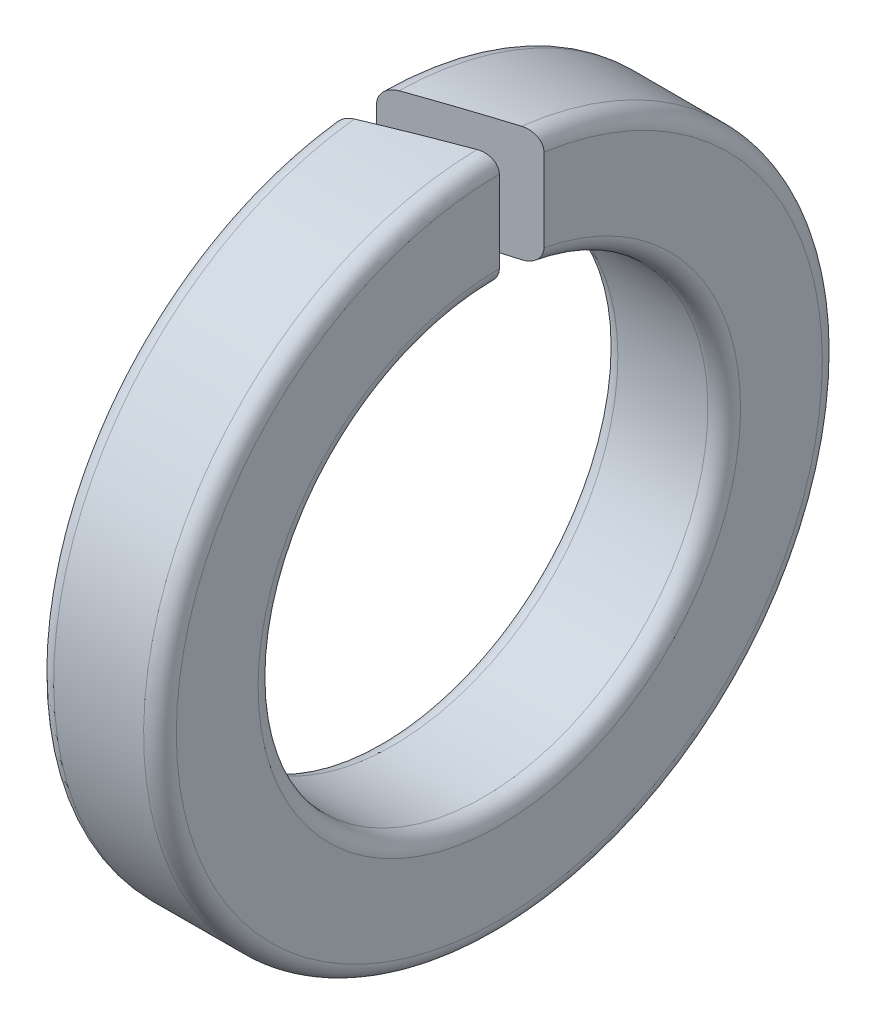
ISO-10303-21;
HEADER;
FILE_DESCRIPTION(('STEP AP214'),'2;1');
FILE_NAME('part.step','',(''),(''),'','','');
FILE_SCHEMA(('AUTOMOTIVE_DESIGN { 1 0 10303 214 1 1 1 1 }'));
ENDSEC;
DATA;
#1=APPLICATION_CONTEXT('core data for automotive mechanical design processes');
#2=APPLICATION_PROTOCOL_DEFINITION('international standard','automotive_design',2000,#1);
#3=PRODUCT_CONTEXT('',#1,'mechanical');
#4=PRODUCT('Part','Part','',(#3));
#5=PRODUCT_RELATED_PRODUCT_CATEGORY('part','',(#4));
#6=PRODUCT_DEFINITION_FORMATION('','',#4);
#7=PRODUCT_DEFINITION_CONTEXT('part definition',#1,'design');
#8=PRODUCT_DEFINITION('design','',#6,#7);
#9=PRODUCT_DEFINITION_SHAPE('','',#8);
#10=(LENGTH_UNIT() NAMED_UNIT(*) SI_UNIT(.MILLI.,.METRE.));
#11=(NAMED_UNIT(*) PLANE_ANGLE_UNIT() SI_UNIT($,.RADIAN.));
#12=(NAMED_UNIT(*) SI_UNIT($,.STERADIAN.) SOLID_ANGLE_UNIT());
#13=UNCERTAINTY_MEASURE_WITH_UNIT(LENGTH_MEASURE(1.E-05),#10,'distance_accuracy_value','');
#14=(GEOMETRIC_REPRESENTATION_CONTEXT(3) GLOBAL_UNCERTAINTY_ASSIGNED_CONTEXT((#13)) GLOBAL_UNIT_ASSIGNED_CONTEXT((#10,
#11,#12)) REPRESENTATION_CONTEXT('',''));
#15=CARTESIAN_POINT('',(0.,0.,0.));
#16=DIRECTION('',(0.,0.,1.));
#17=DIRECTION('',(1.,0.,0.));
#18=AXIS2_PLACEMENT_3D('',#15,#16,#17);
#19=CARTESIAN_POINT('',(0.,0.,-4.15));
#20=DIRECTION('',(1.,0.,0.));
#21=DIRECTION('',(0.,0.,-1.));
#22=AXIS2_PLACEMENT_3D('',#19,#20,#21);
#23=PLANE('',#22);
#24=DIRECTION('',(0.,-1.,0.));
#25=VECTOR('',#24,1.);
#26=CARTESIAN_POINT('',(0.,4.15,0.));
#27=LINE('',#26,#25);
#28=CARTESIAN_POINT('',(0.,3.95,0.));
#29=VERTEX_POINT('',#28);
#30=CARTESIAN_POINT('',(0.,2.95,0.));
#31=VERTEX_POINT('',#30);
#32=EDGE_CURVE('E215',#29,#31,#27,.T.);
#33=ORIENTED_EDGE('',*,*,#32,.F.);
#34=CARTESIAN_POINT('',(0.,0.,0.));
#35=DIRECTION('',(1.,0.,0.));
#36=DIRECTION('',(0.,0.,-1.));
#37=AXIS2_PLACEMENT_3D('',#34,#35,#36);
#38=CIRCLE('',#37,3.95);
#39=CARTESIAN_POINT('',(0.,3.91208802997561,0.545955351399305));
#40=VERTEX_POINT('',#39);
#41=EDGE_CURVE('E217',#29,#40,#38,.F.);
#42=ORIENTED_EDGE('',*,*,#41,.T.);
#43=DIRECTION('',(0.,-1.,0.));
#44=VECTOR('',#43,1.);
#45=CARTESIAN_POINT('',(0.,4.15,0.545955351399305));
#46=LINE('',#45,#44);
#47=CARTESIAN_POINT('',(0.,2.89903997114191,0.545955351399305));
#48=VERTEX_POINT('',#47);
#49=EDGE_CURVE('E105',#40,#48,#46,.T.);
#50=ORIENTED_EDGE('',*,*,#49,.T.);
#51=CARTESIAN_POINT('',(0.,0.,0.));
#52=DIRECTION('',(1.,0.,0.));
#53=DIRECTION('',(0.,0.,-1.));
#54=AXIS2_PLACEMENT_3D('',#51,#52,#53);
#55=CIRCLE('',#54,2.95);
#56=EDGE_CURVE('E50',#48,#31,#55,.T.);
#57=ORIENTED_EDGE('',*,*,#56,.T.);
#58=EDGE_LOOP('',(#33,#42,#50,#57));
#59=FACE_BOUND('',#58,.T.);
#60=ADVANCED_FACE('F36',(#59),#23,.F.);
#61=CARTESIAN_POINT('',(0.,0.,0.));
#62=DIRECTION('',(-1.,0.,0.));
#63=DIRECTION('',(0.,0.,1.));
#64=AXIS2_PLACEMENT_3D('',#61,#62,#63);
#65=CYLINDRICAL_SURFACE('',#64,2.75);
#66=CARTESIAN_POINT('',(1.5,0.,0.));
#67=DIRECTION('',(-0.342020143325669,0.,-0.939692620785908));
#68=DIRECTION('',(-0.939692620785908,0.,0.342020143325669));
#69=AXIS2_PLACEMENT_3D('',#66,#67,#68);
#70=ELLIPSE('',#69,8.04046210044847,2.75);
#71=CARTESIAN_POINT('',(1.3,2.74903638148765,0.072794046853241));
#72=VERTEX_POINT('',#71);
#73=CARTESIAN_POINT('',(0.2,2.70898844218285,0.473161304546064));
#74=VERTEX_POINT('',#73);
#75=EDGE_CURVE('E226',#72,#74,#70,.F.);
#76=ORIENTED_EDGE('',*,*,#75,.F.);
#77=CARTESIAN_POINT('',(1.3,0.,0.));
#78=DIRECTION('',(-1.,0.,0.));
#79=DIRECTION('',(0.,0.,1.));
#80=AXIS2_PLACEMENT_3D('',#77,#78,#79);
#81=CIRCLE('',#80,2.75);
#82=CARTESIAN_POINT('',(1.3,2.70898844218285,-0.473161304546064));
#83=VERTEX_POINT('',#82);
#84=EDGE_CURVE('E11',#72,#83,#81,.F.);
#85=ORIENTED_EDGE('',*,*,#84,.T.);
#86=CARTESIAN_POINT('',(0.,0.,0.));
#87=DIRECTION('',(0.34202014332567,0.,0.939692620785908));
#88=DIRECTION('',(-0.939692620785908,0.,0.342020143325669));
#89=AXIS2_PLACEMENT_3D('',#86,#87,#88);
#90=ELLIPSE('',#89,8.04046210044847,2.75);
#91=CARTESIAN_POINT('',(0.2,2.74903638148765,-0.0727940468532407));
#92=VERTEX_POINT('',#91);
#93=EDGE_CURVE('E228',#92,#83,#90,.F.);
#94=ORIENTED_EDGE('',*,*,#93,.F.);
#95=CARTESIAN_POINT('',(0.2,0.,0.));
#96=DIRECTION('',(1.,0.,0.));
#97=DIRECTION('',(0.,0.,-1.));
#98=AXIS2_PLACEMENT_3D('',#95,#96,#97);
#99=CIRCLE('',#98,2.75);
#100=EDGE_CURVE('E43',#92,#74,#99,.F.);
#101=ORIENTED_EDGE('',*,*,#100,.T.);
#102=EDGE_LOOP('',(#76,#85,#94,#101));
#103=FACE_BOUND('',#102,.T.);
#104=ADVANCED_FACE('F225',(#103),#65,.F.);
#105=CARTESIAN_POINT('',(1.5,0.,-4.15));
#106=DIRECTION('',(-1.,0.,0.));
#107=DIRECTION('',(0.,0.,1.));
#108=AXIS2_PLACEMENT_3D('',#105,#106,#107);
#109=PLANE('',#108);
#110=DIRECTION('',(0.,-1.,0.));
#111=VECTOR('',#110,1.);
#112=CARTESIAN_POINT('',(1.5,4.15,0.));
#113=LINE('',#112,#111);
#114=CARTESIAN_POINT('',(1.5,3.95,0.));
#115=VERTEX_POINT('',#114);
#116=CARTESIAN_POINT('',(1.5,2.95,0.));
#117=VERTEX_POINT('',#116);
#118=EDGE_CURVE('E210',#115,#117,#113,.T.);
#119=ORIENTED_EDGE('',*,*,#118,.F.);
#120=CARTESIAN_POINT('',(1.5,0.,0.));
#121=DIRECTION('',(-1.,0.,0.));
#122=DIRECTION('',(0.,0.,1.));
#123=AXIS2_PLACEMENT_3D('',#120,#121,#122);
#124=CIRCLE('',#123,3.95);
#125=CARTESIAN_POINT('',(1.5,3.91208802997561,-0.545955351399305));
#126=VERTEX_POINT('',#125);
#127=EDGE_CURVE('E160',#115,#126,#124,.F.);
#128=ORIENTED_EDGE('',*,*,#127,.T.);
#129=DIRECTION('',(0.,-1.,0.));
#130=VECTOR('',#129,1.);
#131=CARTESIAN_POINT('',(1.5,4.15,-0.545955351399305));
#132=LINE('',#131,#130);
#133=CARTESIAN_POINT('',(1.5,2.89903997114191,-0.545955351399305));
#134=VERTEX_POINT('',#133);
#135=EDGE_CURVE('E209',#126,#134,#132,.T.);
#136=ORIENTED_EDGE('',*,*,#135,.T.);
#137=CARTESIAN_POINT('',(1.5,0.,0.));
#138=DIRECTION('',(-1.,0.,0.));
#139=DIRECTION('',(0.,0.,1.));
#140=AXIS2_PLACEMENT_3D('',#137,#138,#139);
#141=CIRCLE('',#140,2.95);
#142=EDGE_CURVE('E199',#134,#117,#141,.T.);
#143=ORIENTED_EDGE('',*,*,#142,.T.);
#144=EDGE_LOOP('',(#119,#128,#136,#143));
#145=FACE_BOUND('',#144,.T.);
#146=ADVANCED_FACE('F208',(#145),#109,.F.);
#147=CARTESIAN_POINT('',(0.,0.,0.));
#148=DIRECTION('',(-1.,0.,0.));
#149=DIRECTION('',(0.,0.,1.));
#150=AXIS2_PLACEMENT_3D('',#147,#148,#149);
#151=CYLINDRICAL_SURFACE('',#150,4.15);
#152=CARTESIAN_POINT('',(0.,0.,0.));
#153=DIRECTION('',(0.34202014332567,0.,0.939692620785908));
#154=DIRECTION('',(-0.939692620785908,0.,0.342020143325669));
#155=AXIS2_PLACEMENT_3D('',#152,#153,#154);
#156=ELLIPSE('',#155,12.1337882606768,4.15);
#157=CARTESIAN_POINT('',(1.30000000000001,4.12293807616368,-0.473161304546067));
#158=VERTEX_POINT('',#157);
#159=CARTESIAN_POINT('',(0.200000000000004,4.14936152037187,-0.0727940468532419));
#160=VERTEX_POINT('',#159);
#161=EDGE_CURVE('E120',#158,#160,#156,.T.);
#162=ORIENTED_EDGE('',*,*,#161,.F.);
#163=CARTESIAN_POINT('',(1.3,0.,0.));
#164=DIRECTION('',(-1.,0.,0.));
#165=DIRECTION('',(0.,0.,1.));
#166=AXIS2_PLACEMENT_3D('',#163,#164,#165);
#167=CIRCLE('',#166,4.15);
#168=CARTESIAN_POINT('',(1.3,4.14936152037187,0.0727940468532405));
#169=VERTEX_POINT('',#168);
#170=EDGE_CURVE('E119',#158,#169,#167,.T.);
#171=ORIENTED_EDGE('',*,*,#170,.T.);
#172=CARTESIAN_POINT('',(1.5,0.,0.));
#173=DIRECTION('',(-0.342020143325669,0.,-0.939692620785908));
#174=DIRECTION('',(-0.939692620785908,0.,0.342020143325669));
#175=AXIS2_PLACEMENT_3D('',#172,#173,#174);
#176=ELLIPSE('',#175,12.1337882606768,4.15);
#177=CARTESIAN_POINT('',(0.2,4.12293807616368,0.473161304546064));
#178=VERTEX_POINT('',#177);
#179=EDGE_CURVE('E104',#178,#169,#176,.T.);
#180=ORIENTED_EDGE('',*,*,#179,.F.);
#181=CARTESIAN_POINT('',(0.2,0.,0.));
#182=DIRECTION('',(1.,0.,0.));
#183=DIRECTION('',(0.,0.,-1.));
#184=AXIS2_PLACEMENT_3D('',#181,#182,#183);
#185=CIRCLE('',#184,4.15);
#186=EDGE_CURVE('E117',#178,#160,#185,.T.);
#187=ORIENTED_EDGE('',*,*,#186,.T.);
#188=EDGE_LOOP('',(#162,#171,#180,#187));
#189=FACE_BOUND('',#188,.T.);
#190=ADVANCED_FACE('F116',(#189),#151,.T.);
#191=CARTESIAN_POINT('',(0.,4.15,0.));
#192=DIRECTION('',(0.34202014332567,0.,0.939692620785908));
#193=DIRECTION('',(0.939692620785908,0.,-0.34202014332567));
#194=AXIS2_PLACEMENT_3D('',#191,#192,#193);
#195=PLANE('',#194);
#196=ORIENTED_EDGE('',*,*,#135,.F.);
#197=CARTESIAN_POINT('',(1.5,3.91208802997561,-0.545955351399305));
#198=CARTESIAN_POINT('',(1.50000966657736,3.92339249288332,-0.545958869745733));
#199=CARTESIAN_POINT('',(1.4990608152971,3.93468237677815,-0.545613516122972));
#200=CARTESIAN_POINT('',(1.49537612215494,3.95689178448735,-0.544272397496821));
#201=CARTESIAN_POINT('',(1.49264601886771,3.96781237958895,-0.543278721163797));
#202=CARTESIAN_POINT('',(1.48553100676617,3.98900741849946,-0.540689068542391));
#203=CARTESIAN_POINT('',(1.48114781377743,3.99928251944313,-0.539093716763445));
#204=CARTESIAN_POINT('',(1.47089451883765,4.01895953403028,-0.535361822602214));
#205=CARTESIAN_POINT('',(1.46502348035094,4.0283608925767,-0.533224939348819));
#206=CARTESIAN_POINT('',(1.45167297504677,4.0464983518444,-0.528365752805689));
#207=CARTESIAN_POINT('',(1.44413054945031,4.05518192966211,-0.525620534394411));
#208=CARTESIAN_POINT('',(1.42784747734382,4.07116829768677,-0.519693980825236));
#209=CARTESIAN_POINT('',(1.41910642257188,4.07847061540125,-0.51651249707216));
#210=CARTESIAN_POINT('',(1.40014122439928,4.09190655306077,-0.509609729450374));
#211=CARTESIAN_POINT('',(1.38986119914167,4.09795086704484,-0.505868106249098));
#212=CARTESIAN_POINT('',(1.36851523279008,4.10817313521352,-0.498098809875473));
#213=CARTESIAN_POINT('',(1.35744967204726,4.11235198559542,-0.494071275139622));
#214=CARTESIAN_POINT('',(1.3386044994056,4.1176692378773,-0.487212193238451));
#215=CARTESIAN_POINT('',(1.33095781244359,4.11935672668745,-0.484429026793526));
#216=CARTESIAN_POINT('',(1.31554764728482,4.12182816402349,-0.478820185370609));
#217=CARTESIAN_POINT('',(1.30778434719524,4.12261337167401,-0.475994575218324));
#218=CARTESIAN_POINT('',(1.30000000000063,4.12293807616621,-0.473161304546294));
#219=B_SPLINE_CURVE_WITH_KNOTS('',3,(#197,#198,#199,#200,#201,#202,#203,#204,#205,#206,#207,
#208,#209,#210,#211,#212,#213,#214,#215,#216,#217,#218),.UNSPECIFIED.,.F.,.F.,(4,2,2,2,2,2,2,2,
2,2,4),(0.,0.0338468380997619,0.0675851683302756,0.101288575786616,0.135013251033681,
0.170333594573219,0.205665998502381,0.242994040188065,0.280304129560537,0.305189073585429,
0.330039248576616),.UNSPECIFIED.);
#220=EDGE_CURVE('E181',#126,#158,#219,.T.);
#221=ORIENTED_EDGE('',*,*,#220,.T.);
#222=ORIENTED_EDGE('',*,*,#161,.T.);
#223=CARTESIAN_POINT('',(0.2,4.14936152037187,-0.0727940468532407));
#224=CARTESIAN_POINT('',(0.188298039389431,4.14944367700689,-0.068534881508438));
#225=CARTESIAN_POINT('',(0.176588301659844,4.14847752090005,-0.0642728855238046));
#226=CARTESIAN_POINT('',(0.153469310469096,4.14449002773067,-0.0558582608841096));
#227=CARTESIAN_POINT('',(0.142060395990911,4.14146646714747,-0.0517057556087614));
#228=CARTESIAN_POINT('',(0.119873100463656,4.13340098437426,-0.0436302404579729));
#229=CARTESIAN_POINT('',(0.109095459431182,4.12835674563405,-0.0397074999265462));
#230=CARTESIAN_POINT('',(0.0885299570974865,4.11635779069655,-0.0322222692243491));
#231=CARTESIAN_POINT('',(0.0787414034686111,4.10940442367596,-0.02865952706692));
#232=CARTESIAN_POINT('',(0.0607675543101974,4.09399164234606,-0.0221175809780668));
#233=CARTESIAN_POINT('',(0.052542056513047,4.0855854191706,-0.0191237446178818));
#234=CARTESIAN_POINT('',(0.0376283882056316,4.06734189721966,-0.0136956132702634));
#235=CARTESIAN_POINT('',(0.0309402369654252,4.05750458050848,-0.0112613252965577));
#236=CARTESIAN_POINT('',(0.0196992960241561,4.03727611704708,-0.00716995738879138));
#237=CARTESIAN_POINT('',(0.0150477469282185,4.02694701777426,-0.00547693197464224));
#238=CARTESIAN_POINT('',(0.00754588138121199,4.00557964369354,-0.00274647621406471));
#239=CARTESIAN_POINT('',(0.00469296141173309,3.9945424195318,-0.00170809826443075));
#240=CARTESIAN_POINT('',(0.00186695720635967,3.9778316459894,-0.000679516851763706));
#241=CARTESIAN_POINT('',(0.00116717420021907,3.97228758350938,-0.000424816667083202));
#242=CARTESIAN_POINT('',(0.000233986590217577,3.96116334229359,-8.51641540566415E-05));
#243=CARTESIAN_POINT('',(-9.60208021648097E-08,3.95558322794608,3.4948713858797E-08));
#244=CARTESIAN_POINT('',(0.,3.95000000000001,0.));
#245=B_SPLINE_CURVE_WITH_KNOTS('',3,(#223,#224,#225,#226,#227,#228,#229,#230,#231,#232,#233,
#234,#235,#236,#237,#238,#239,#240,#241,#242,#243,#244),.UNSPECIFIED.,.F.,.F.,(4,2,2,2,2,2,2,2,
2,2,4),(0.,0.0373199467122671,0.0746802908022035,0.112083588756326,0.149460521618525,
0.185682215157652,0.221904362697272,0.256094065132226,0.290234163602285,0.306996589807914,
0.323734593903641),.UNSPECIFIED.);
#246=EDGE_CURVE('E57',#160,#29,#245,.T.);
#247=ORIENTED_EDGE('',*,*,#246,.T.);
#248=ORIENTED_EDGE('',*,*,#32,.T.);
#249=CARTESIAN_POINT('',(0.,2.95,0.));
#250=CARTESIAN_POINT('',(-1.17208001722382E-05,2.93922821602432,4.26602238447583E-06));
#251=CARTESIAN_POINT('',(0.000869404938413847,2.92846340260029,-0.000316437519106683));
#252=CARTESIAN_POINT('',(0.00432644402459111,2.90727362974312,-0.00157469684517004));
#253=CARTESIAN_POINT('',(0.00689803949818061,2.89684787528462,-0.00251068105213032));
#254=CARTESIAN_POINT('',(0.0136454940816845,2.87660562961144,-0.0049665536775888));
#255=CARTESIAN_POINT('',(0.0178211398657029,2.86678905758193,-0.00648636445181065));
#256=CARTESIAN_POINT('',(0.0276221773687847,2.84801260634477,-0.0100536503678592));
#257=CARTESIAN_POINT('',(0.0332480188252583,2.839052994083,-0.0121012892007164));
#258=CARTESIAN_POINT('',(0.0459306113107111,2.82197256638422,-0.0167173753587494));
#259=CARTESIAN_POINT('',(0.0530216525091769,2.81388064541563,-0.0192983032849463));
#260=CARTESIAN_POINT('',(0.0683124798959518,2.79898685647009,-0.0248637093110349));
#261=CARTESIAN_POINT('',(0.076512590753156,2.79218536766027,-0.0278483055807403));
#262=CARTESIAN_POINT('',(0.0943342175178068,2.77961211697603,-0.0343348472492751));
#263=CARTESIAN_POINT('',(0.104012648150368,2.7739317998269,-0.0378575079139378));
#264=CARTESIAN_POINT('',(0.124090682631822,2.76426518840076,-0.0451653148277573));
#265=CARTESIAN_POINT('',(0.134490444038417,2.76027926558823,-0.0489505184232283));
#266=CARTESIAN_POINT('',(0.154052913540071,2.7545588355581,-0.0560706750305709));
#267=CARTESIAN_POINT('',(0.163150369080277,2.75256758550063,-0.0593818780547661));
#268=CARTESIAN_POINT('',(0.181496338793651,2.74985122848559,-0.0660592649491833));
#269=CARTESIAN_POINT('',(0.190744596300279,2.74912415908877,-0.069425355400425));
#270=CARTESIAN_POINT('',(0.2,2.74903638148765,-0.0727940468532407));
#271=B_SPLINE_CURVE_WITH_KNOTS('',3,(#249,#250,#251,#252,#253,#254,#255,#256,#257,#258,#259,
#260,#261,#262,#263,#264,#265,#266,#267,#268,#269,#270),.UNSPECIFIED.,.F.,.F.,(4,2,2,2,2,2,2,2,
2,2,4),(0.,0.0322638495478951,0.0644456078678668,0.0966230877515848,0.12881055860656,
0.161860154883282,0.194919447119773,0.230054053726084,0.265196358974656,0.294767583581978,
0.324292862448988),.UNSPECIFIED.);
#272=EDGE_CURVE('E152',#31,#92,#271,.T.);
#273=ORIENTED_EDGE('',*,*,#272,.T.);
#274=ORIENTED_EDGE('',*,*,#93,.T.);
#275=CARTESIAN_POINT('',(1.3,2.70898844218285,-0.473161304546064));
#276=CARTESIAN_POINT('',(1.31126923690899,2.70826441919251,-0.47726297134383));
#277=CARTESIAN_POINT('',(1.32260425757297,2.70850884787553,-0.481388581470311));
#278=CARTESIAN_POINT('',(1.34511715787691,2.71097147165301,-0.489582607067947));
#279=CARTESIAN_POINT('',(1.35629444170517,2.71319578086253,-0.493650805681381));
#280=CARTESIAN_POINT('',(1.37815677219323,2.71966808045584,-0.501608043230723));
#281=CARTESIAN_POINT('',(1.38884050914101,2.72392115013236,-0.505496605470445));
#282=CARTESIAN_POINT('',(1.4093015288154,2.73440270341136,-0.512943807594659));
#283=CARTESIAN_POINT('',(1.41908018779752,2.74062812191905,-0.516502948395193));
#284=CARTESIAN_POINT('',(1.43678078277764,2.75445843638295,-0.522945438096757));
#285=CARTESIAN_POINT('',(1.44478171357892,2.76194875719639,-0.525857538754847));
#286=CARTESIAN_POINT('',(1.45938534274684,2.77834355872733,-0.531172825084232));
#287=CARTESIAN_POINT('',(1.46598826372931,2.78724781389744,-0.53357609178106));
#288=CARTESIAN_POINT('',(1.47717939848602,2.80557203989302,-0.537649331720165));
#289=CARTESIAN_POINT('',(1.48187046383507,2.81492116774851,-0.539356739874219));
#290=CARTESIAN_POINT('',(1.48968510038526,2.83433429559758,-0.542201034970097));
#291=CARTESIAN_POINT('',(1.49280908395486,2.84439810672984,-0.543338072001768));
#292=CARTESIAN_POINT('',(1.49674800112202,2.86193049577196,-0.544771720605855));
#293=CARTESIAN_POINT('',(1.49797079504268,2.86929892916256,-0.545216781195615));
#294=CARTESIAN_POINT('',(1.49959694900565,2.88412459356297,-0.545808652834471));
#295=CARTESIAN_POINT('',(1.50000174852558,2.89158164531506,-0.545955987810568));
#296=CARTESIAN_POINT('',(1.50000000000028,2.89903997114183,-0.545955351399407));
#297=B_SPLINE_CURVE_WITH_KNOTS('',3,(#275,#276,#277,#278,#279,#280,#281,#282,#283,#284,#285,
#286,#287,#288,#289,#290,#291,#292,#293,#294,#295,#296),.UNSPECIFIED.,.F.,.F.,(4,2,2,2,2,2,2,2,
2,2,4),(0.,0.036023085152446,0.0721578014692499,0.108383464896526,0.144553106332756,
0.178394786954014,0.212231074645202,0.243874056196679,0.275508706707678,0.297907274835426,
0.320266392309185),.UNSPECIFIED.);
#298=EDGE_CURVE('E159',#83,#134,#297,.T.);
#299=ORIENTED_EDGE('',*,*,#298,.T.);
#300=EDGE_LOOP('',(#196,#221,#222,#247,#248,#273,#274,#299));
#301=FACE_BOUND('',#300,.T.);
#302=ADVANCED_FACE('F167',(#301),#195,.T.);
#303=CARTESIAN_POINT('',(1.5,4.15,0.));
#304=DIRECTION('',(-0.342020143325669,0.,-0.939692620785908));
#305=DIRECTION('',(-0.939692620785908,0.,0.342020143325669));
#306=AXIS2_PLACEMENT_3D('',#303,#304,#305);
#307=PLANE('',#306);
#308=ORIENTED_EDGE('',*,*,#179,.T.);
#309=CARTESIAN_POINT('',(1.3,4.14936152037187,0.0727940468532407));
#310=CARTESIAN_POINT('',(1.31170196061057,4.14944367700689,0.0685348815084381));
#311=CARTESIAN_POINT('',(1.32341169834016,4.14847752090005,0.0642728855238047));
#312=CARTESIAN_POINT('',(1.3465306895309,4.14449002773067,0.0558582608841097));
#313=CARTESIAN_POINT('',(1.35793960400909,4.14146646714747,0.0517057556087615));
#314=CARTESIAN_POINT('',(1.38012689953634,4.13340098437426,0.043630240457973));
#315=CARTESIAN_POINT('',(1.39090454056882,4.12835674563405,0.0397074999265463));
#316=CARTESIAN_POINT('',(1.41147004290251,4.11635779069655,0.0322222692243492));
#317=CARTESIAN_POINT('',(1.42125859653139,4.10940442367596,0.0286595270669201));
#318=CARTESIAN_POINT('',(1.4392324456898,4.09399164234606,0.0221175809780669));
#319=CARTESIAN_POINT('',(1.44745794348695,4.0855854191706,0.0191237446178819));
#320=CARTESIAN_POINT('',(1.46237161179437,4.06734189721966,0.0136956132702635));
#321=CARTESIAN_POINT('',(1.46905976303457,4.05750458050848,0.0112613252965578));
#322=CARTESIAN_POINT('',(1.48030070397584,4.03727611704708,0.00716995738879141));
#323=CARTESIAN_POINT('',(1.48495225307178,4.02694701777426,0.00547693197464217));
#324=CARTESIAN_POINT('',(1.49245411861879,4.00557964369354,0.00274647621406468));
#325=CARTESIAN_POINT('',(1.49530703858827,3.99454241953179,0.00170809826443082));
#326=CARTESIAN_POINT('',(1.49813304279364,3.9778316459894,0.00067951685176382));
#327=CARTESIAN_POINT('',(1.49883282579978,3.97228758350938,0.00042481666708331));
#328=CARTESIAN_POINT('',(1.49976601340978,3.96116334229359,8.51641540567419E-05));
#329=CARTESIAN_POINT('',(1.5000000960208,3.95558322794608,-3.49487137586686E-08));
#330=CARTESIAN_POINT('',(1.50000000000004,3.95000000000001,0.));
#331=B_SPLINE_CURVE_WITH_KNOTS('',3,(#309,#310,#311,#312,#313,#314,#315,#316,#317,#318,#319,
#320,#321,#322,#323,#324,#325,#326,#327,#328,#329,#330),.UNSPECIFIED.,.F.,.F.,(4,2,2,2,2,2,2,2,
2,2,4),(0.,0.037319946712267,0.0746802908022035,0.112083588756326,0.149460521618525,
0.185682215157652,0.221904362697272,0.256094065132227,0.290234163602285,0.306996589807914,
0.323734593903641),.UNSPECIFIED.);
#332=EDGE_CURVE('E110',#169,#115,#331,.T.);
#333=ORIENTED_EDGE('',*,*,#332,.T.);
#334=ORIENTED_EDGE('',*,*,#118,.T.);
#335=CARTESIAN_POINT('',(1.5,2.95,0.));
#336=CARTESIAN_POINT('',(1.50001172080017,2.93922821602432,-4.26602238439667E-06));
#337=CARTESIAN_POINT('',(1.49913059506159,2.92846340260029,0.000316437519106779));
#338=CARTESIAN_POINT('',(1.49567355597541,2.90727362974312,0.00157469684517013));
#339=CARTESIAN_POINT('',(1.49310196050182,2.89684787528462,0.00251068105213041));
#340=CARTESIAN_POINT('',(1.48635450591832,2.87660562961144,0.0049665536775889));
#341=CARTESIAN_POINT('',(1.4821788601343,2.86678905758193,0.00648636445181077));
#342=CARTESIAN_POINT('',(1.47237782263122,2.84801260634476,0.0100536503678593));
#343=CARTESIAN_POINT('',(1.46675198117474,2.839052994083,0.0121012892007165));
#344=CARTESIAN_POINT('',(1.45406938868929,2.82197256638422,0.0167173753587495));
#345=CARTESIAN_POINT('',(1.44697834749082,2.81388064541563,0.0192983032849464));
#346=CARTESIAN_POINT('',(1.43168752010405,2.79898685647009,0.024863709311035));
#347=CARTESIAN_POINT('',(1.42348740924684,2.79218536766026,0.0278483055807404));
#348=CARTESIAN_POINT('',(1.40566578248219,2.77961211697603,0.0343348472492752));
#349=CARTESIAN_POINT('',(1.39598735184963,2.7739317998269,0.0378575079139379));
#350=CARTESIAN_POINT('',(1.37590931736818,2.76426518840076,0.0451653148277575));
#351=CARTESIAN_POINT('',(1.36550955596158,2.76027926558823,0.0489505184232284));
#352=CARTESIAN_POINT('',(1.34594708645993,2.7545588355581,0.0560706750305709));
#353=CARTESIAN_POINT('',(1.33684963091972,2.75256758550063,0.0593818780547661));
#354=CARTESIAN_POINT('',(1.31850366120635,2.74985122848559,0.0660592649491833));
#355=CARTESIAN_POINT('',(1.30925540369972,2.74912415908877,0.069425355400425));
#356=CARTESIAN_POINT('',(1.3,2.74903638148765,0.0727940468532408));
#357=B_SPLINE_CURVE_WITH_KNOTS('',3,(#335,#336,#337,#338,#339,#340,#341,#342,#343,#344,#345,
#346,#347,#348,#349,#350,#351,#352,#353,#354,#355,#356),.UNSPECIFIED.,.F.,.F.,(4,2,2,2,2,2,2,2,
2,2,4),(0.,0.0322638495478947,0.0644456078678668,0.0966230877515848,0.128810558606561,
0.161860154883282,0.194919447119773,0.230054053726085,0.265196358974656,0.294767583581978,
0.324292862448988),.UNSPECIFIED.);
#358=EDGE_CURVE('E111',#117,#72,#357,.T.);
#359=ORIENTED_EDGE('',*,*,#358,.T.);
#360=ORIENTED_EDGE('',*,*,#75,.T.);
#361=CARTESIAN_POINT('',(0.2,2.70898844218285,0.473161304546064));
#362=CARTESIAN_POINT('',(0.188730763091013,2.70826441919251,0.47726297134383));
#363=CARTESIAN_POINT('',(0.177395742427032,2.70850884787553,0.481388581470311));
#364=CARTESIAN_POINT('',(0.154882842123094,2.71097147165301,0.489582607067947));
#365=CARTESIAN_POINT('',(0.143705558294826,2.71319578086253,0.493650805681381));
#366=CARTESIAN_POINT('',(0.121843227806773,2.71966808045584,0.501608043230723));
#367=CARTESIAN_POINT('',(0.111159490858994,2.72392115013236,0.505496605470445));
#368=CARTESIAN_POINT('',(0.0906984711846025,2.73440270341136,0.512943807594659));
#369=CARTESIAN_POINT('',(0.0809198122024756,2.74062812191905,0.516502948395193));
#370=CARTESIAN_POINT('',(0.0632192172223603,2.75445843638295,0.522945438096756));
#371=CARTESIAN_POINT('',(0.055218286421077,2.76194875719639,0.525857538754847));
#372=CARTESIAN_POINT('',(0.0406146572531572,2.77834355872733,0.531172825084231));
#373=CARTESIAN_POINT('',(0.0340117362706941,2.78724781389744,0.53357609178106));
#374=CARTESIAN_POINT('',(0.0228206015139828,2.80557203989302,0.537649331720165));
#375=CARTESIAN_POINT('',(0.018129536164926,2.81492116774851,0.539356739874219));
#376=CARTESIAN_POINT('',(0.0103148996147364,2.83433429559758,0.542201034970097));
#377=CARTESIAN_POINT('',(0.00719091604513833,2.84439810672984,0.543338072001767));
#378=CARTESIAN_POINT('',(0.0032519988779767,2.86193049577196,0.544771720605854));
#379=CARTESIAN_POINT('',(0.00202920495732153,2.86929892916256,0.545216781195614));
#380=CARTESIAN_POINT('',(0.000403050994346311,2.88412459356297,0.545808652834471));
#381=CARTESIAN_POINT('',(-1.74852557556398E-06,2.89158164531505,0.545955987810568));
#382=CARTESIAN_POINT('',(-2.79784474789215E-13,2.89903997114183,0.545955351399407));
#383=B_SPLINE_CURVE_WITH_KNOTS('',3,(#361,#362,#363,#364,#365,#366,#367,#368,#369,#370,#371,
#372,#373,#374,#375,#376,#377,#378,#379,#380,#381,#382),.UNSPECIFIED.,.F.,.F.,(4,2,2,2,2,2,2,2,
2,2,4),(0.,0.036023085152446,0.0721578014692498,0.108383464896526,0.144553106332756,
0.178394786954014,0.212231074645202,0.243874056196678,0.275508706707677,0.297907274835425,
0.320266392309185),.UNSPECIFIED.);
#384=EDGE_CURVE('E124',#74,#48,#383,.T.);
#385=ORIENTED_EDGE('',*,*,#384,.T.);
#386=ORIENTED_EDGE('',*,*,#49,.F.);
#387=CARTESIAN_POINT('',(0.,3.91208802997561,0.545955351399305));
#388=CARTESIAN_POINT('',(-9.6665773646146E-06,3.92339249288332,0.545958869745733));
#389=CARTESIAN_POINT('',(0.000939184702897143,3.93468237677815,0.545613516122972));
#390=CARTESIAN_POINT('',(0.00462387784505719,3.95689178448735,0.544272397496821));
#391=CARTESIAN_POINT('',(0.00735398113228809,3.96781237958895,0.543278721163797));
#392=CARTESIAN_POINT('',(0.0144689932338309,3.98900741849946,0.540689068542391));
#393=CARTESIAN_POINT('',(0.0188521862225734,3.99928251944313,0.539093716763445));
#394=CARTESIAN_POINT('',(0.0291054811623482,4.01895953403028,0.535361822602214));
#395=CARTESIAN_POINT('',(0.0349765196490626,4.0283608925767,0.533224939348819));
#396=CARTESIAN_POINT('',(0.0483270249532319,4.0464983518444,0.528365752805688));
#397=CARTESIAN_POINT('',(0.0558694505496884,4.05518192966211,0.525620534394411));
#398=CARTESIAN_POINT('',(0.0721525226561847,4.07116829768677,0.519693980825236));
#399=CARTESIAN_POINT('',(0.0808935774281241,4.07847061540125,0.516512497072159));
#400=CARTESIAN_POINT('',(0.0998587756007237,4.09190655306077,0.509609729450373));
#401=CARTESIAN_POINT('',(0.110138800858335,4.09795086704484,0.505868106249098));
#402=CARTESIAN_POINT('',(0.13148476720992,4.10817313521352,0.498098809875473));
#403=CARTESIAN_POINT('',(0.142550327952741,4.11235198559542,0.494071275139622));
#404=CARTESIAN_POINT('',(0.161395500594398,4.1176692378773,0.487212193238451));
#405=CARTESIAN_POINT('',(0.169042187556414,4.11935672668745,0.484429026793525));
#406=CARTESIAN_POINT('',(0.184452352715179,4.12182816402349,0.478820185370609));
#407=CARTESIAN_POINT('',(0.192215652804765,4.12261337167401,0.475994575218323));
#408=CARTESIAN_POINT('',(0.19999999999937,4.12293807616621,0.473161304546294));
#409=B_SPLINE_CURVE_WITH_KNOTS('',3,(#387,#388,#389,#390,#391,#392,#393,#394,#395,#396,#397,
#398,#399,#400,#401,#402,#403,#404,#405,#406,#407,#408),.UNSPECIFIED.,.F.,.F.,(4,2,2,2,2,2,2,2,
2,2,4),(0.,0.0338468380997619,0.0675851683302756,0.101288575786616,0.13501325103368,
0.170333594573219,0.205665998502382,0.242994040188065,0.280304129560537,0.305189073585429,
0.330039248576615),.UNSPECIFIED.);
#410=EDGE_CURVE('E101',#40,#178,#409,.T.);
#411=ORIENTED_EDGE('',*,*,#410,.T.);
#412=EDGE_LOOP('',(#308,#333,#334,#359,#360,#385,#386,#411));
#413=FACE_BOUND('',#412,.T.);
#414=ADVANCED_FACE('F103',(#413),#307,.T.);
#415=CARTESIAN_POINT('',(1.3,0.,0.));
#416=DIRECTION('',(-1.,0.,0.));
#417=DIRECTION('',(0.,0.,1.));
#418=AXIS2_PLACEMENT_3D('',#415,#416,#417);
#419=TOROIDAL_SURFACE('',#418,3.95,0.2);
#420=ORIENTED_EDGE('',*,*,#220,.F.);
#421=ORIENTED_EDGE('',*,*,#127,.F.);
#422=ORIENTED_EDGE('',*,*,#332,.F.);
#423=ORIENTED_EDGE('',*,*,#170,.F.);
#424=EDGE_LOOP('',(#420,#421,#422,#423));
#425=FACE_BOUND('',#424,.T.);
#426=ADVANCED_FACE('F171',(#425),#419,.T.);
#427=CARTESIAN_POINT('',(0.2,0.,0.));
#428=DIRECTION('',(1.,0.,0.));
#429=DIRECTION('',(0.,0.,-1.));
#430=AXIS2_PLACEMENT_3D('',#427,#428,#429);
#431=TOROIDAL_SURFACE('',#430,3.95,0.2);
#432=ORIENTED_EDGE('',*,*,#246,.F.);
#433=ORIENTED_EDGE('',*,*,#186,.F.);
#434=ORIENTED_EDGE('',*,*,#410,.F.);
#435=ORIENTED_EDGE('',*,*,#41,.F.);
#436=EDGE_LOOP('',(#432,#433,#434,#435));
#437=FACE_BOUND('',#436,.T.);
#438=ADVANCED_FACE('F122',(#437),#431,.T.);
#439=CARTESIAN_POINT('',(1.3,0.,0.));
#440=DIRECTION('',(-1.,0.,0.));
#441=DIRECTION('',(0.,0.,1.));
#442=AXIS2_PLACEMENT_3D('',#439,#440,#441);
#443=TOROIDAL_SURFACE('',#442,2.95,0.2);
#444=ORIENTED_EDGE('',*,*,#298,.F.);
#445=ORIENTED_EDGE('',*,*,#84,.F.);
#446=ORIENTED_EDGE('',*,*,#358,.F.);
#447=ORIENTED_EDGE('',*,*,#142,.F.);
#448=EDGE_LOOP('',(#444,#445,#446,#447));
#449=FACE_BOUND('',#448,.T.);
#450=ADVANCED_FACE('F146',(#449),#443,.T.);
#451=CARTESIAN_POINT('',(0.2,0.,0.));
#452=DIRECTION('',(1.,0.,0.));
#453=DIRECTION('',(0.,0.,-1.));
#454=AXIS2_PLACEMENT_3D('',#451,#452,#453);
#455=TOROIDAL_SURFACE('',#454,2.95,0.2);
#456=ORIENTED_EDGE('',*,*,#272,.F.);
#457=ORIENTED_EDGE('',*,*,#56,.F.);
#458=ORIENTED_EDGE('',*,*,#384,.F.);
#459=ORIENTED_EDGE('',*,*,#100,.F.);
#460=EDGE_LOOP('',(#456,#457,#458,#459));
#461=FACE_BOUND('',#460,.T.);
#462=ADVANCED_FACE('F143',(#461),#455,.T.);
#463=CLOSED_SHELL('',(#60,#104,#146,#190,#302,#414,#426,#438,#450,#462));
#464=MANIFOLD_SOLID_BREP('B2',#463);
#465=ADVANCED_BREP_SHAPE_REPRESENTATION('',(#18,#464),#14);
#466=SHAPE_DEFINITION_REPRESENTATION(#9,#465);
ENDSEC;
END-ISO-10303-21;
